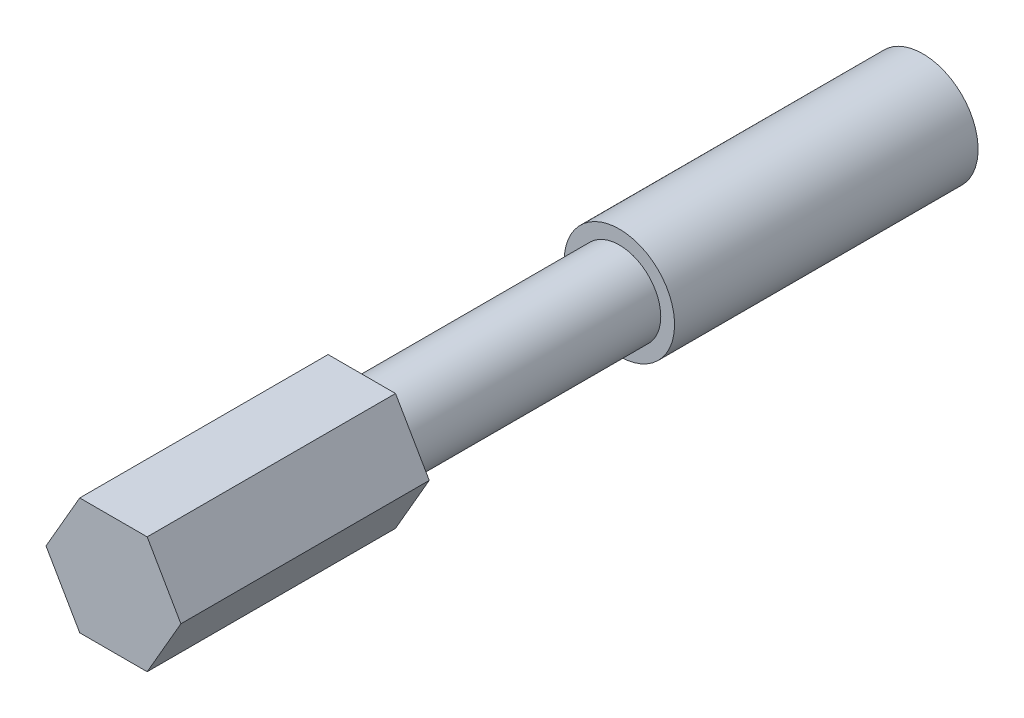
ISO-10303-21;
HEADER;
FILE_DESCRIPTION(('STEP AP214'),'2;1');
FILE_NAME('part.step','',(''),(''),'','','');
FILE_SCHEMA(('AUTOMOTIVE_DESIGN { 1 0 10303 214 1 1 1 1 }'));
ENDSEC;
DATA;
#1=APPLICATION_CONTEXT('core data for automotive mechanical design processes');
#2=APPLICATION_PROTOCOL_DEFINITION('international standard','automotive_design',2000,#1);
#3=PRODUCT_CONTEXT('',#1,'mechanical');
#4=PRODUCT('Part','Part','',(#3));
#5=PRODUCT_RELATED_PRODUCT_CATEGORY('part','',(#4));
#6=PRODUCT_DEFINITION_FORMATION('','',#4);
#7=PRODUCT_DEFINITION_CONTEXT('part definition',#1,'design');
#8=PRODUCT_DEFINITION('design','',#6,#7);
#9=PRODUCT_DEFINITION_SHAPE('','',#8);
#10=(LENGTH_UNIT() NAMED_UNIT(*) SI_UNIT(.MILLI.,.METRE.));
#11=(NAMED_UNIT(*) PLANE_ANGLE_UNIT() SI_UNIT($,.RADIAN.));
#12=(NAMED_UNIT(*) SI_UNIT($,.STERADIAN.) SOLID_ANGLE_UNIT());
#13=UNCERTAINTY_MEASURE_WITH_UNIT(LENGTH_MEASURE(1.E-05),#10,'distance_accuracy_value','');
#14=(GEOMETRIC_REPRESENTATION_CONTEXT(3) GLOBAL_UNCERTAINTY_ASSIGNED_CONTEXT((#13)) GLOBAL_UNIT_ASSIGNED_CONTEXT((#10,
#11,#12)) REPRESENTATION_CONTEXT('',''));
#15=CARTESIAN_POINT('',(0.,0.,0.));
#16=DIRECTION('',(0.,0.,1.));
#17=DIRECTION('',(1.,0.,0.));
#18=AXIS2_PLACEMENT_3D('',#15,#16,#17);
#19=CARTESIAN_POINT('',(0.,0.,-61.));
#20=DIRECTION('',(0.,0.,1.));
#21=DIRECTION('',(1.,0.,0.));
#22=AXIS2_PLACEMENT_3D('',#19,#20,#21);
#23=CYLINDRICAL_SURFACE('',#22,4.5);
#24=CARTESIAN_POINT('',(0.,0.,0.));
#25=DIRECTION('',(0.,0.,-1.));
#26=DIRECTION('',(-1.,0.,0.));
#27=AXIS2_PLACEMENT_3D('',#24,#25,#26);
#28=CIRCLE('',#27,4.5);
#29=CARTESIAN_POINT('',(4.5,0.,0.));
#30=VERTEX_POINT('',#29);
#31=EDGE_CURVE('E47',#30,#30,#28,.T.);
#32=CARTESIAN_POINT('',(0.,0.,-28.));
#33=DIRECTION('',(0.,0.,-1.));
#34=DIRECTION('',(-1.,0.,0.));
#35=AXIS2_PLACEMENT_3D('',#32,#33,#34);
#36=CIRCLE('',#35,4.5);
#37=CARTESIAN_POINT('',(4.5,0.,-28.));
#38=VERTEX_POINT('',#37);
#39=EDGE_CURVE('E11',#38,#38,#36,.T.);
#40=CARTESIAN_POINT('',(4.5,0.,0.));
#41=CARTESIAN_POINT('',(4.5,0.,-0.291666666666659));
#42=CARTESIAN_POINT('',(4.5,0.,-0.583333333333327));
#43=CARTESIAN_POINT('',(4.5,0.,-1.16666666666666));
#44=CARTESIAN_POINT('',(4.5,0.,-1.45833333333333));
#45=CARTESIAN_POINT('',(4.5,0.,-2.04166666666666));
#46=CARTESIAN_POINT('',(4.5,0.,-2.33333333333333));
#47=CARTESIAN_POINT('',(4.5,0.,-2.91666666666666));
#48=CARTESIAN_POINT('',(4.5,0.,-3.20833333333333));
#49=CARTESIAN_POINT('',(4.5,0.,-3.79166666666666));
#50=CARTESIAN_POINT('',(4.5,0.,-4.08333333333333));
#51=CARTESIAN_POINT('',(4.5,0.,-4.66666666666666));
#52=CARTESIAN_POINT('',(4.5,0.,-4.95833333333332));
#53=CARTESIAN_POINT('',(4.5,0.,-5.54166666666666));
#54=CARTESIAN_POINT('',(4.5,0.,-5.83333333333333));
#55=CARTESIAN_POINT('',(4.5,0.,-6.41666666666666));
#56=CARTESIAN_POINT('',(4.5,0.,-6.70833333333333));
#57=CARTESIAN_POINT('',(4.5,0.,-7.29166666666666));
#58=CARTESIAN_POINT('',(4.5,0.,-7.58333333333333));
#59=CARTESIAN_POINT('',(4.5,0.,-8.16666666666666));
#60=CARTESIAN_POINT('',(4.5,0.,-8.45833333333333));
#61=CARTESIAN_POINT('',(4.5,0.,-9.04166666666666));
#62=CARTESIAN_POINT('',(4.5,0.,-9.33333333333332));
#63=CARTESIAN_POINT('',(4.5,0.,-9.91666666666666));
#64=CARTESIAN_POINT('',(4.5,0.,-10.2083333333333));
#65=CARTESIAN_POINT('',(4.5,0.,-10.7916666666667));
#66=CARTESIAN_POINT('',(4.5,0.,-11.0833333333333));
#67=CARTESIAN_POINT('',(4.5,0.,-11.6666666666667));
#68=CARTESIAN_POINT('',(4.5,0.,-11.9583333333333));
#69=CARTESIAN_POINT('',(4.5,0.,-12.5416666666667));
#70=CARTESIAN_POINT('',(4.5,0.,-12.8333333333333));
#71=CARTESIAN_POINT('',(4.5,0.,-13.4166666666667));
#72=CARTESIAN_POINT('',(4.5,0.,-13.7083333333333));
#73=CARTESIAN_POINT('',(4.5,0.,-14.2916666666667));
#74=CARTESIAN_POINT('',(4.5,0.,-14.5833333333333));
#75=CARTESIAN_POINT('',(4.5,0.,-15.1666666666667));
#76=CARTESIAN_POINT('',(4.5,0.,-15.4583333333333));
#77=CARTESIAN_POINT('',(4.5,0.,-16.0416666666667));
#78=CARTESIAN_POINT('',(4.5,0.,-16.3333333333333));
#79=CARTESIAN_POINT('',(4.5,0.,-16.9166666666667));
#80=CARTESIAN_POINT('',(4.5,0.,-17.2083333333333));
#81=CARTESIAN_POINT('',(4.5,0.,-17.7916666666667));
#82=CARTESIAN_POINT('',(4.5,0.,-18.0833333333333));
#83=CARTESIAN_POINT('',(4.5,0.,-18.6666666666667));
#84=CARTESIAN_POINT('',(4.5,0.,-18.9583333333333));
#85=CARTESIAN_POINT('',(4.5,0.,-19.5416666666667));
#86=CARTESIAN_POINT('',(4.5,0.,-19.8333333333333));
#87=CARTESIAN_POINT('',(4.5,0.,-20.4166666666667));
#88=CARTESIAN_POINT('',(4.5,0.,-20.7083333333333));
#89=CARTESIAN_POINT('',(4.5,0.,-21.2916666666667));
#90=CARTESIAN_POINT('',(4.5,0.,-21.5833333333333));
#91=CARTESIAN_POINT('',(4.5,0.,-22.1666666666667));
#92=CARTESIAN_POINT('',(4.5,0.,-22.4583333333333));
#93=CARTESIAN_POINT('',(4.5,0.,-23.0416666666667));
#94=CARTESIAN_POINT('',(4.5,0.,-23.3333333333333));
#95=CARTESIAN_POINT('',(4.5,0.,-23.9166666666667));
#96=CARTESIAN_POINT('',(4.5,0.,-24.2083333333333));
#97=CARTESIAN_POINT('',(4.5,0.,-24.7916666666667));
#98=CARTESIAN_POINT('',(4.5,0.,-25.0833333333333));
#99=CARTESIAN_POINT('',(4.5,0.,-25.6666666666667));
#100=CARTESIAN_POINT('',(4.5,0.,-25.9583333333333));
#101=CARTESIAN_POINT('',(4.5,0.,-26.5416666666667));
#102=CARTESIAN_POINT('',(4.5,0.,-26.8333333333333));
#103=CARTESIAN_POINT('',(4.5,0.,-27.4166666666667));
#104=CARTESIAN_POINT('',(4.5,0.,-27.7083333333333));
#105=CARTESIAN_POINT('',(4.5,0.,-28.));
#106=B_SPLINE_CURVE_WITH_KNOTS('',3,(#40,#41,#42,#43,#44,#45,#46,#47,#48,#49,#50,#51,#52,#53,
#54,#55,#56,#57,#58,#59,#60,#61,#62,#63,#64,#65,#66,#67,#68,#69,#70,#71,#72,#73,#74,#75,#76,#77,
#78,#79,#80,#81,#82,#83,#84,#85,#86,#87,#88,#89,#90,#91,#92,#93,#94,#95,#96,#97,#98,#99,#100,
#101,#102,#103,#104,#105),.UNSPECIFIED.,.F.,.F.,(4,2,2,2,2,2,2,2,2,2,2,2,2,2,2,2,2,2,2,2,2,2,2,
2,2,2,2,2,2,2,2,2,4),(0.,0.875000000000001,1.75,2.625,3.5,4.375,5.25,6.125,7.,7.875,8.75,
9.62499999999999,10.5,11.375,12.25,13.125,14.,14.875,15.75,16.625,17.5,18.375,19.25,20.125,21.,
21.875,22.75,23.625,24.5,25.375,26.25,27.125,28.),.UNSPECIFIED.);
#107=EDGE_CURVE('BSEAM39',#30,#38,#106,.T.);
#108=ORIENTED_EDGE('',*,*,#31,.T.);
#109=ORIENTED_EDGE('',*,*,#39,.F.);
#110=ORIENTED_EDGE('',*,*,#107,.T.);
#111=ORIENTED_EDGE('',*,*,#107,.F.);
#112=EDGE_LOOP('',(#108,#110,#109,#111));
#113=FACE_BOUND('',#112,.T.);
#114=ADVANCED_FACE('F39',(#113),#23,.T.);
#115=CARTESIAN_POINT('',(-3.66617420935412,-6.35,27.));
#116=DIRECTION('',(0.,1.,0.));
#117=DIRECTION('',(-1.,0.,0.));
#118=AXIS2_PLACEMENT_3D('',#115,#116,#117);
#119=PLANE('',#118);
#120=DIRECTION('',(1.,0.,0.));
#121=VECTOR('',#120,1.);
#122=CARTESIAN_POINT('',(-3.66617420935412,-6.35,0.));
#123=LINE('',#122,#121);
#124=CARTESIAN_POINT('',(-3.66617420935412,-6.35,0.));
#125=VERTEX_POINT('',#124);
#126=CARTESIAN_POINT('',(3.66617420935412,-6.35,0.));
#127=VERTEX_POINT('',#126);
#128=EDGE_CURVE('E137',#125,#127,#123,.T.);
#129=ORIENTED_EDGE('',*,*,#128,.T.);
#130=DIRECTION('',(0.,0.,-1.));
#131=VECTOR('',#130,1.);
#132=CARTESIAN_POINT('',(3.66617420935412,-6.35,27.));
#133=LINE('',#132,#131);
#134=CARTESIAN_POINT('',(3.66617420935412,-6.35,27.));
#135=VERTEX_POINT('',#134);
#136=EDGE_CURVE('E155',#135,#127,#133,.T.);
#137=ORIENTED_EDGE('',*,*,#136,.F.);
#138=DIRECTION('',(1.,0.,0.));
#139=VECTOR('',#138,1.);
#140=CARTESIAN_POINT('',(-3.66617420935412,-6.35,27.));
#141=LINE('',#140,#139);
#142=CARTESIAN_POINT('',(-3.66617420935412,-6.35,27.));
#143=VERTEX_POINT('',#142);
#144=EDGE_CURVE('E149',#143,#135,#141,.T.);
#145=ORIENTED_EDGE('',*,*,#144,.F.);
#146=DIRECTION('',(0.,0.,-1.));
#147=VECTOR('',#146,1.);
#148=CARTESIAN_POINT('',(-3.66617420935412,-6.35,27.));
#149=LINE('',#148,#147);
#150=EDGE_CURVE('E133',#143,#125,#149,.T.);
#151=ORIENTED_EDGE('',*,*,#150,.T.);
#152=EDGE_LOOP('',(#129,#137,#145,#151));
#153=FACE_BOUND('',#152,.T.);
#154=ADVANCED_FACE('F41',(#153),#119,.F.);
#155=CARTESIAN_POINT('',(3.66617420935412,-6.35,27.));
#156=DIRECTION('',(-0.866025403784439,0.5,0.));
#157=DIRECTION('',(-0.5,-0.866025403784439,0.));
#158=AXIS2_PLACEMENT_3D('',#155,#156,#157);
#159=PLANE('',#158);
#160=DIRECTION('',(0.5,0.866025403784439,0.));
#161=VECTOR('',#160,1.);
#162=CARTESIAN_POINT('',(3.66617420935412,-6.35,0.));
#163=LINE('',#162,#161);
#164=CARTESIAN_POINT('',(7.33234841870825,0.,0.));
#165=VERTEX_POINT('',#164);
#166=EDGE_CURVE('E140',#127,#165,#163,.T.);
#167=ORIENTED_EDGE('',*,*,#166,.T.);
#168=DIRECTION('',(0.,0.,-1.));
#169=VECTOR('',#168,1.);
#170=CARTESIAN_POINT('',(7.33234841870825,0.,27.));
#171=LINE('',#170,#169);
#172=CARTESIAN_POINT('',(7.33234841870825,0.,27.));
#173=VERTEX_POINT('',#172);
#174=EDGE_CURVE('E153',#173,#165,#171,.T.);
#175=ORIENTED_EDGE('',*,*,#174,.F.);
#176=DIRECTION('',(0.5,0.866025403784439,0.));
#177=VECTOR('',#176,1.);
#178=CARTESIAN_POINT('',(3.66617420935412,-6.35,27.));
#179=LINE('',#178,#177);
#180=EDGE_CURVE('E99',#135,#173,#179,.T.);
#181=ORIENTED_EDGE('',*,*,#180,.F.);
#182=ORIENTED_EDGE('',*,*,#136,.T.);
#183=EDGE_LOOP('',(#167,#175,#181,#182));
#184=FACE_BOUND('',#183,.T.);
#185=ADVANCED_FACE('F167',(#184),#159,.F.);
#186=CARTESIAN_POINT('',(7.33234841870825,0.,27.));
#187=DIRECTION('',(-0.866025403784439,-0.5,0.));
#188=DIRECTION('',(0.5,-0.866025403784439,0.));
#189=AXIS2_PLACEMENT_3D('',#186,#187,#188);
#190=PLANE('',#189);
#191=DIRECTION('',(-0.5,0.866025403784439,0.));
#192=VECTOR('',#191,1.);
#193=CARTESIAN_POINT('',(7.33234841870825,0.,0.));
#194=LINE('',#193,#192);
#195=CARTESIAN_POINT('',(3.66617420935412,6.35,0.));
#196=VERTEX_POINT('',#195);
#197=EDGE_CURVE('E143',#165,#196,#194,.T.);
#198=ORIENTED_EDGE('',*,*,#197,.T.);
#199=DIRECTION('',(0.,0.,-1.));
#200=VECTOR('',#199,1.);
#201=CARTESIAN_POINT('',(3.66617420935412,6.35,27.));
#202=LINE('',#201,#200);
#203=CARTESIAN_POINT('',(3.66617420935412,6.35,27.));
#204=VERTEX_POINT('',#203);
#205=EDGE_CURVE('E128',#204,#196,#202,.T.);
#206=ORIENTED_EDGE('',*,*,#205,.F.);
#207=DIRECTION('',(-0.5,0.866025403784439,0.));
#208=VECTOR('',#207,1.);
#209=CARTESIAN_POINT('',(7.33234841870825,0.,27.));
#210=LINE('',#209,#208);
#211=EDGE_CURVE('E116',#173,#204,#210,.T.);
#212=ORIENTED_EDGE('',*,*,#211,.F.);
#213=ORIENTED_EDGE('',*,*,#174,.T.);
#214=EDGE_LOOP('',(#198,#206,#212,#213));
#215=FACE_BOUND('',#214,.T.);
#216=ADVANCED_FACE('F170',(#215),#190,.F.);
#217=CARTESIAN_POINT('',(3.66617420935412,6.35,27.));
#218=DIRECTION('',(0.,-1.,0.));
#219=DIRECTION('',(1.,0.,0.));
#220=AXIS2_PLACEMENT_3D('',#217,#218,#219);
#221=PLANE('',#220);
#222=DIRECTION('',(-1.,0.,0.));
#223=VECTOR('',#222,1.);
#224=CARTESIAN_POINT('',(3.66617420935412,6.35,0.));
#225=LINE('',#224,#223);
#226=CARTESIAN_POINT('',(-3.66617420935412,6.35,0.));
#227=VERTEX_POINT('',#226);
#228=EDGE_CURVE('E125',#196,#227,#225,.T.);
#229=ORIENTED_EDGE('',*,*,#228,.T.);
#230=DIRECTION('',(0.,0.,-1.));
#231=VECTOR('',#230,1.);
#232=CARTESIAN_POINT('',(-3.66617420935412,6.35,27.));
#233=LINE('',#232,#231);
#234=CARTESIAN_POINT('',(-3.66617420935412,6.35,27.));
#235=VERTEX_POINT('',#234);
#236=EDGE_CURVE('E122',#235,#227,#233,.T.);
#237=ORIENTED_EDGE('',*,*,#236,.F.);
#238=DIRECTION('',(-1.,0.,0.));
#239=VECTOR('',#238,1.);
#240=CARTESIAN_POINT('',(3.66617420935412,6.35,27.));
#241=LINE('',#240,#239);
#242=EDGE_CURVE('E109',#204,#235,#241,.T.);
#243=ORIENTED_EDGE('',*,*,#242,.F.);
#244=ORIENTED_EDGE('',*,*,#205,.T.);
#245=EDGE_LOOP('',(#229,#237,#243,#244));
#246=FACE_BOUND('',#245,.T.);
#247=ADVANCED_FACE('F123',(#246),#221,.F.);
#248=CARTESIAN_POINT('',(-3.66617420935412,6.35,27.));
#249=DIRECTION('',(0.866025403784439,-0.5,0.));
#250=DIRECTION('',(0.5,0.866025403784439,0.));
#251=AXIS2_PLACEMENT_3D('',#248,#249,#250);
#252=PLANE('',#251);
#253=DIRECTION('',(-0.5,-0.866025403784439,0.));
#254=VECTOR('',#253,1.);
#255=CARTESIAN_POINT('',(-3.66617420935412,6.35,0.));
#256=LINE('',#255,#254);
#257=CARTESIAN_POINT('',(-7.33234841870825,0.,0.));
#258=VERTEX_POINT('',#257);
#259=EDGE_CURVE('E146',#227,#258,#256,.T.);
#260=ORIENTED_EDGE('',*,*,#259,.T.);
#261=DIRECTION('',(0.,0.,-1.));
#262=VECTOR('',#261,1.);
#263=CARTESIAN_POINT('',(-7.33234841870825,0.,27.));
#264=LINE('',#263,#262);
#265=CARTESIAN_POINT('',(-7.33234841870825,0.,27.));
#266=VERTEX_POINT('',#265);
#267=EDGE_CURVE('E129',#266,#258,#264,.T.);
#268=ORIENTED_EDGE('',*,*,#267,.F.);
#269=DIRECTION('',(-0.5,-0.866025403784439,0.));
#270=VECTOR('',#269,1.);
#271=CARTESIAN_POINT('',(-3.66617420935412,6.35,27.));
#272=LINE('',#271,#270);
#273=EDGE_CURVE('E113',#235,#266,#272,.T.);
#274=ORIENTED_EDGE('',*,*,#273,.F.);
#275=ORIENTED_EDGE('',*,*,#236,.T.);
#276=EDGE_LOOP('',(#260,#268,#274,#275));
#277=FACE_BOUND('',#276,.T.);
#278=ADVANCED_FACE('F131',(#277),#252,.F.);
#279=CARTESIAN_POINT('',(-7.33234841870825,0.,27.));
#280=DIRECTION('',(0.866025403784439,0.5,0.));
#281=DIRECTION('',(-0.5,0.866025403784439,0.));
#282=AXIS2_PLACEMENT_3D('',#279,#280,#281);
#283=PLANE('',#282);
#284=DIRECTION('',(0.5,-0.866025403784439,0.));
#285=VECTOR('',#284,1.);
#286=CARTESIAN_POINT('',(-7.33234841870825,0.,0.));
#287=LINE('',#286,#285);
#288=EDGE_CURVE('E90',#258,#125,#287,.T.);
#289=ORIENTED_EDGE('',*,*,#288,.T.);
#290=ORIENTED_EDGE('',*,*,#150,.F.);
#291=DIRECTION('',(0.5,-0.866025403784439,0.));
#292=VECTOR('',#291,1.);
#293=CARTESIAN_POINT('',(-7.33234841870825,0.,27.));
#294=LINE('',#293,#292);
#295=EDGE_CURVE('E63',#266,#143,#294,.T.);
#296=ORIENTED_EDGE('',*,*,#295,.F.);
#297=ORIENTED_EDGE('',*,*,#267,.T.);
#298=EDGE_LOOP('',(#289,#290,#296,#297));
#299=FACE_BOUND('',#298,.T.);
#300=ADVANCED_FACE('F174',(#299),#283,.F.);
#301=CARTESIAN_POINT('',(0.,0.,27.));
#302=DIRECTION('',(0.,0.,1.));
#303=DIRECTION('',(1.,0.,0.));
#304=AXIS2_PLACEMENT_3D('',#301,#302,#303);
#305=PLANE('',#304);
#306=ORIENTED_EDGE('',*,*,#144,.T.);
#307=ORIENTED_EDGE('',*,*,#180,.T.);
#308=ORIENTED_EDGE('',*,*,#211,.T.);
#309=ORIENTED_EDGE('',*,*,#242,.T.);
#310=ORIENTED_EDGE('',*,*,#273,.T.);
#311=ORIENTED_EDGE('',*,*,#295,.T.);
#312=EDGE_LOOP('',(#306,#307,#308,#309,#310,#311));
#313=FACE_BOUND('',#312,.T.);
#314=ADVANCED_FACE('F111',(#313),#305,.T.);
#315=CARTESIAN_POINT('',(0.,0.,0.));
#316=DIRECTION('',(0.,0.,1.));
#317=DIRECTION('',(1.,0.,0.));
#318=AXIS2_PLACEMENT_3D('',#315,#316,#317);
#319=PLANE('',#318);
#320=ORIENTED_EDGE('',*,*,#31,.F.);
#321=EDGE_LOOP('',(#320));
#322=FACE_BOUND('',#321,.T.);
#323=ORIENTED_EDGE('',*,*,#128,.F.);
#324=ORIENTED_EDGE('',*,*,#288,.F.);
#325=ORIENTED_EDGE('',*,*,#259,.F.);
#326=ORIENTED_EDGE('',*,*,#228,.F.);
#327=ORIENTED_EDGE('',*,*,#197,.F.);
#328=ORIENTED_EDGE('',*,*,#166,.F.);
#329=EDGE_LOOP('',(#323,#324,#325,#326,#327,#328));
#330=FACE_BOUND('',#329,.T.);
#331=ADVANCED_FACE('F173',(#322,#330),#319,.F.);
#332=CARTESIAN_POINT('',(0.,0.,-28.));
#333=DIRECTION('',(0.,0.,-1.));
#334=DIRECTION('',(-1.,0.,0.));
#335=AXIS2_PLACEMENT_3D('',#332,#333,#334);
#336=CYLINDRICAL_SURFACE('',#335,6.);
#337=CARTESIAN_POINT('',(0.,0.,-28.));
#338=DIRECTION('',(0.,0.,-1.));
#339=DIRECTION('',(-1.,0.,0.));
#340=AXIS2_PLACEMENT_3D('',#337,#338,#339);
#341=CIRCLE('',#340,6.);
#342=CARTESIAN_POINT('',(-6.,0.,-28.));
#343=VERTEX_POINT('',#342);
#344=EDGE_CURVE('E337',#343,#343,#341,.T.);
#345=ORIENTED_EDGE('',*,*,#344,.T.);
#346=EDGE_LOOP('',(#345));
#347=FACE_BOUND('',#346,.T.);
#348=CARTESIAN_POINT('',(0.,0.,-61.));
#349=DIRECTION('',(0.,0.,-1.));
#350=DIRECTION('',(-1.,0.,0.));
#351=AXIS2_PLACEMENT_3D('',#348,#349,#350);
#352=CIRCLE('',#351,6.);
#353=CARTESIAN_POINT('',(-6.,0.,-61.));
#354=VERTEX_POINT('',#353);
#355=EDGE_CURVE('E335',#354,#354,#352,.T.);
#356=ORIENTED_EDGE('',*,*,#355,.F.);
#357=EDGE_LOOP('',(#356));
#358=FACE_BOUND('',#357,.T.);
#359=ADVANCED_FACE('F195',(#347,#358),#336,.T.);
#360=CARTESIAN_POINT('',(0.,0.,-28.));
#361=DIRECTION('',(0.,0.,-1.));
#362=DIRECTION('',(-1.,0.,0.));
#363=AXIS2_PLACEMENT_3D('',#360,#361,#362);
#364=PLANE('',#363);
#365=ORIENTED_EDGE('',*,*,#39,.T.);
#366=EDGE_LOOP('',(#365));
#367=FACE_BOUND('',#366,.T.);
#368=ORIENTED_EDGE('',*,*,#344,.F.);
#369=EDGE_LOOP('',(#368));
#370=FACE_BOUND('',#369,.T.);
#371=ADVANCED_FACE('F274',(#367,#370),#364,.F.);
#372=CARTESIAN_POINT('',(0.,0.,-47.));
#373=DIRECTION('',(0.,0.,-1.));
#374=DIRECTION('',(-1.,0.,0.));
#375=AXIS2_PLACEMENT_3D('',#372,#373,#374);
#376=PLANE('',#375);
#377=CARTESIAN_POINT('',(0.,0.,-47.));
#378=DIRECTION('',(0.,0.,-1.));
#379=DIRECTION('',(-1.,0.,0.));
#380=AXIS2_PLACEMENT_3D('',#377,#378,#379);
#381=CIRCLE('',#380,4.);
#382=CARTESIAN_POINT('',(2.64575131106459,3.,-47.));
#383=VERTEX_POINT('',#382);
#384=CARTESIAN_POINT('',(2.64575131106459,-3.,-47.));
#385=VERTEX_POINT('',#384);
#386=EDGE_CURVE('E342',#383,#385,#381,.T.);
#387=ORIENTED_EDGE('',*,*,#386,.T.);
#388=DIRECTION('',(-1.,0.,0.));
#389=VECTOR('',#388,1.);
#390=CARTESIAN_POINT('',(2.64575131106459,-3.,-47.));
#391=LINE('',#390,#389);
#392=CARTESIAN_POINT('',(-2.64575131106459,-3.,-47.));
#393=VERTEX_POINT('',#392);
#394=EDGE_CURVE('E345',#385,#393,#391,.T.);
#395=ORIENTED_EDGE('',*,*,#394,.T.);
#396=CARTESIAN_POINT('',(0.,0.,-47.));
#397=DIRECTION('',(0.,0.,-1.));
#398=DIRECTION('',(-1.,0.,0.));
#399=AXIS2_PLACEMENT_3D('',#396,#397,#398);
#400=CIRCLE('',#399,4.);
#401=CARTESIAN_POINT('',(-2.64575131106459,3.,-47.));
#402=VERTEX_POINT('',#401);
#403=EDGE_CURVE('E349',#393,#402,#400,.T.);
#404=ORIENTED_EDGE('',*,*,#403,.T.);
#405=DIRECTION('',(1.,0.,0.));
#406=VECTOR('',#405,1.);
#407=CARTESIAN_POINT('',(2.64575131106459,3.,-47.));
#408=LINE('',#407,#406);
#409=EDGE_CURVE('E352',#402,#383,#408,.T.);
#410=ORIENTED_EDGE('',*,*,#409,.T.);
#411=EDGE_LOOP('',(#387,#395,#404,#410));
#412=FACE_BOUND('',#411,.T.);
#413=ADVANCED_FACE('F266',(#412),#376,.T.);
#414=CARTESIAN_POINT('',(2.64575131106459,-3.,-47.));
#415=DIRECTION('',(0.,-1.,0.));
#416=DIRECTION('',(0.,0.,-1.));
#417=AXIS2_PLACEMENT_3D('',#414,#415,#416);
#418=PLANE('',#417);
#419=DIRECTION('',(-1.,0.,0.));
#420=VECTOR('',#419,1.);
#421=CARTESIAN_POINT('',(2.64575131106459,-3.,-61.));
#422=LINE('',#421,#420);
#423=CARTESIAN_POINT('',(2.64575131106459,-3.,-61.));
#424=VERTEX_POINT('',#423);
#425=CARTESIAN_POINT('',(-2.64575131106459,-3.,-61.));
#426=VERTEX_POINT('',#425);
#427=EDGE_CURVE('E356',#424,#426,#422,.T.);
#428=ORIENTED_EDGE('',*,*,#427,.T.);
#429=DIRECTION('',(0.,0.,-1.));
#430=VECTOR('',#429,1.);
#431=CARTESIAN_POINT('',(-2.64575131106459,-3.,-47.));
#432=LINE('',#431,#430);
#433=EDGE_CURVE('E367',#393,#426,#432,.T.);
#434=ORIENTED_EDGE('',*,*,#433,.F.);
#435=ORIENTED_EDGE('',*,*,#394,.F.);
#436=DIRECTION('',(0.,0.,-1.));
#437=VECTOR('',#436,1.);
#438=CARTESIAN_POINT('',(2.64575131106459,-3.,-47.));
#439=LINE('',#438,#437);
#440=EDGE_CURVE('E163',#385,#424,#439,.T.);
#441=ORIENTED_EDGE('',*,*,#440,.T.);
#442=EDGE_LOOP('',(#428,#434,#435,#441));
#443=FACE_BOUND('',#442,.T.);
#444=ADVANCED_FACE('F258',(#443),#418,.F.);
#445=CARTESIAN_POINT('',(0.,0.,-47.));
#446=DIRECTION('',(0.,0.,-1.));
#447=DIRECTION('',(-1.,0.,0.));
#448=AXIS2_PLACEMENT_3D('',#445,#446,#447);
#449=CYLINDRICAL_SURFACE('',#448,4.);
#450=CARTESIAN_POINT('',(0.,0.,-61.));
#451=DIRECTION('',(0.,0.,-1.));
#452=DIRECTION('',(-1.,0.,0.));
#453=AXIS2_PLACEMENT_3D('',#450,#451,#452);
#454=CIRCLE('',#453,4.);
#455=CARTESIAN_POINT('',(-2.64575131106459,3.,-61.));
#456=VERTEX_POINT('',#455);
#457=EDGE_CURVE('E359',#426,#456,#454,.T.);
#458=ORIENTED_EDGE('',*,*,#457,.T.);
#459=DIRECTION('',(0.,0.,-1.));
#460=VECTOR('',#459,1.);
#461=CARTESIAN_POINT('',(-2.64575131106459,3.,-47.));
#462=LINE('',#461,#460);
#463=EDGE_CURVE('E365',#402,#456,#462,.T.);
#464=ORIENTED_EDGE('',*,*,#463,.F.);
#465=ORIENTED_EDGE('',*,*,#403,.F.);
#466=ORIENTED_EDGE('',*,*,#433,.T.);
#467=EDGE_LOOP('',(#458,#464,#465,#466));
#468=FACE_BOUND('',#467,.T.);
#469=ADVANCED_FACE('F249',(#468),#449,.F.);
#470=CARTESIAN_POINT('',(2.64575131106459,3.,-47.));
#471=DIRECTION('',(0.,1.,0.));
#472=DIRECTION('',(0.,0.,1.));
#473=AXIS2_PLACEMENT_3D('',#470,#471,#472);
#474=PLANE('',#473);
#475=DIRECTION('',(1.,0.,0.));
#476=VECTOR('',#475,1.);
#477=CARTESIAN_POINT('',(2.64575131106459,3.,-61.));
#478=LINE('',#477,#476);
#479=CARTESIAN_POINT('',(2.64575131106459,3.,-61.));
#480=VERTEX_POINT('',#479);
#481=EDGE_CURVE('E346',#456,#480,#478,.T.);
#482=ORIENTED_EDGE('',*,*,#481,.T.);
#483=DIRECTION('',(0.,0.,-1.));
#484=VECTOR('',#483,1.);
#485=CARTESIAN_POINT('',(2.64575131106459,3.,-47.));
#486=LINE('',#485,#484);
#487=EDGE_CURVE('E141',#383,#480,#486,.T.);
#488=ORIENTED_EDGE('',*,*,#487,.F.);
#489=ORIENTED_EDGE('',*,*,#409,.F.);
#490=ORIENTED_EDGE('',*,*,#463,.T.);
#491=EDGE_LOOP('',(#482,#488,#489,#490));
#492=FACE_BOUND('',#491,.T.);
#493=ADVANCED_FACE('F242',(#492),#474,.F.);
#494=CARTESIAN_POINT('',(0.,0.,-47.));
#495=DIRECTION('',(0.,0.,-1.));
#496=DIRECTION('',(-1.,0.,0.));
#497=AXIS2_PLACEMENT_3D('',#494,#495,#496);
#498=CYLINDRICAL_SURFACE('',#497,4.);
#499=CARTESIAN_POINT('',(0.,0.,-61.));
#500=DIRECTION('',(0.,0.,-1.));
#501=DIRECTION('',(-1.,0.,0.));
#502=AXIS2_PLACEMENT_3D('',#499,#500,#501);
#503=CIRCLE('',#502,4.);
#504=EDGE_CURVE('E54',#480,#424,#503,.T.);
#505=ORIENTED_EDGE('',*,*,#504,.T.);
#506=ORIENTED_EDGE('',*,*,#440,.F.);
#507=ORIENTED_EDGE('',*,*,#386,.F.);
#508=ORIENTED_EDGE('',*,*,#487,.T.);
#509=EDGE_LOOP('',(#505,#506,#507,#508));
#510=FACE_BOUND('',#509,.T.);
#511=ADVANCED_FACE('F238',(#510),#498,.F.);
#512=CARTESIAN_POINT('',(0.,0.,-61.));
#513=DIRECTION('',(0.,0.,-1.));
#514=DIRECTION('',(-1.,0.,0.));
#515=AXIS2_PLACEMENT_3D('',#512,#513,#514);
#516=PLANE('',#515);
#517=ORIENTED_EDGE('',*,*,#504,.F.);
#518=ORIENTED_EDGE('',*,*,#481,.F.);
#519=ORIENTED_EDGE('',*,*,#457,.F.);
#520=ORIENTED_EDGE('',*,*,#427,.F.);
#521=EDGE_LOOP('',(#517,#518,#519,#520));
#522=FACE_BOUND('',#521,.T.);
#523=ORIENTED_EDGE('',*,*,#355,.T.);
#524=EDGE_LOOP('',(#523));
#525=FACE_BOUND('',#524,.T.);
#526=ADVANCED_FACE('F189',(#522,#525),#516,.T.);
#527=CLOSED_SHELL('',(#114,#154,#185,#216,#247,#278,#300,#314,#331,#359,#371,#413,#444,#469,
#493,#511,#526));
#528=MANIFOLD_SOLID_BREP('B2',#527);
#529=ADVANCED_BREP_SHAPE_REPRESENTATION('',(#18,#528),#14);
#530=SHAPE_DEFINITION_REPRESENTATION(#9,#529);
ENDSEC;
END-ISO-10303-21;
